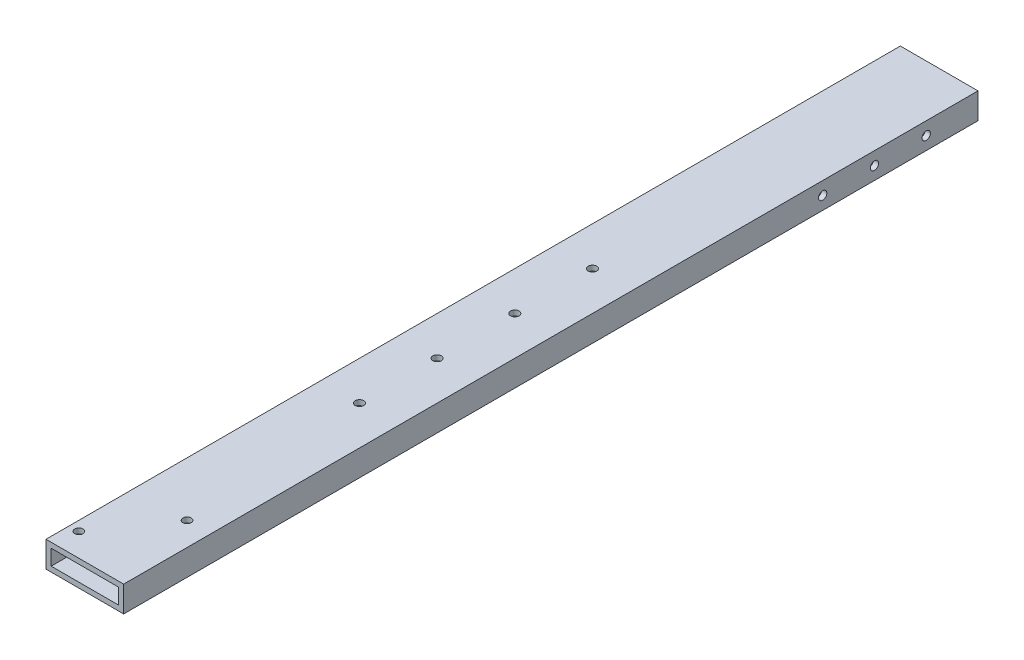
ISO-10303-21;
HEADER;
FILE_DESCRIPTION(('STEP AP214'),'2;1');
FILE_NAME('part.step','',(''),(''),'','','');
FILE_SCHEMA(('AUTOMOTIVE_DESIGN { 1 0 10303 214 1 1 1 1 }'));
ENDSEC;
DATA;
#1=APPLICATION_CONTEXT('core data for automotive mechanical design processes');
#2=APPLICATION_PROTOCOL_DEFINITION('international standard','automotive_design',2000,#1);
#3=PRODUCT_CONTEXT('',#1,'mechanical');
#4=PRODUCT('Part','Part','',(#3));
#5=PRODUCT_RELATED_PRODUCT_CATEGORY('part','',(#4));
#6=PRODUCT_DEFINITION_FORMATION('','',#4);
#7=PRODUCT_DEFINITION_CONTEXT('part definition',#1,'design');
#8=PRODUCT_DEFINITION('design','',#6,#7);
#9=PRODUCT_DEFINITION_SHAPE('','',#8);
#10=(LENGTH_UNIT() NAMED_UNIT(*) SI_UNIT(.MILLI.,.METRE.));
#11=(NAMED_UNIT(*) PLANE_ANGLE_UNIT() SI_UNIT($,.RADIAN.));
#12=(NAMED_UNIT(*) SI_UNIT($,.STERADIAN.) SOLID_ANGLE_UNIT());
#13=UNCERTAINTY_MEASURE_WITH_UNIT(LENGTH_MEASURE(1.E-05),#10,'distance_accuracy_value','');
#14=(GEOMETRIC_REPRESENTATION_CONTEXT(3) GLOBAL_UNCERTAINTY_ASSIGNED_CONTEXT((#13)) GLOBAL_UNIT_ASSIGNED_CONTEXT((#10,
#11,#12)) REPRESENTATION_CONTEXT('',''));
#15=CARTESIAN_POINT('',(0.,0.,0.));
#16=DIRECTION('',(0.,0.,1.));
#17=DIRECTION('',(1.,0.,0.));
#18=AXIS2_PLACEMENT_3D('',#15,#16,#17);
#19=CARTESIAN_POINT('',(0.,0.,330.));
#20=DIRECTION('',(0.,0.,1.));
#21=DIRECTION('',(1.,0.,0.));
#22=AXIS2_PLACEMENT_3D('',#19,#20,#21);
#23=PLANE('',#22);
#24=DIRECTION('',(0.,1.,0.));
#25=VECTOR('',#24,1.);
#26=CARTESIAN_POINT('',(15.,5.,330.));
#27=LINE('',#26,#25);
#28=CARTESIAN_POINT('',(15.,-5.,330.));
#29=VERTEX_POINT('',#28);
#30=CARTESIAN_POINT('',(15.,5.,330.));
#31=VERTEX_POINT('',#30);
#32=EDGE_CURVE('E161',#29,#31,#27,.T.);
#33=ORIENTED_EDGE('',*,*,#32,.T.);
#34=DIRECTION('',(-1.,0.,0.));
#35=VECTOR('',#34,1.);
#36=CARTESIAN_POINT('',(-15.,5.,330.));
#37=LINE('',#36,#35);
#38=CARTESIAN_POINT('',(-15.,5.,330.));
#39=VERTEX_POINT('',#38);
#40=EDGE_CURVE('E165',#31,#39,#37,.T.);
#41=ORIENTED_EDGE('',*,*,#40,.T.);
#42=DIRECTION('',(0.,-1.,0.));
#43=VECTOR('',#42,1.);
#44=CARTESIAN_POINT('',(-15.,5.,330.));
#45=LINE('',#44,#43);
#46=CARTESIAN_POINT('',(-15.,-5.,330.));
#47=VERTEX_POINT('',#46);
#48=EDGE_CURVE('E169',#39,#47,#45,.T.);
#49=ORIENTED_EDGE('',*,*,#48,.T.);
#50=DIRECTION('',(1.,0.,0.));
#51=VECTOR('',#50,1.);
#52=CARTESIAN_POINT('',(-15.,-5.,330.));
#53=LINE('',#52,#51);
#54=EDGE_CURVE('E172',#47,#29,#53,.T.);
#55=ORIENTED_EDGE('',*,*,#54,.T.);
#56=EDGE_LOOP('',(#33,#41,#49,#55));
#57=FACE_BOUND('',#56,.T.);
#58=DIRECTION('',(-1.,0.,0.));
#59=VECTOR('',#58,1.);
#60=CARTESIAN_POINT('',(-13.,3.,330.));
#61=LINE('',#60,#59);
#62=CARTESIAN_POINT('',(13.,3.,330.));
#63=VERTEX_POINT('',#62);
#64=CARTESIAN_POINT('',(-13.,3.,330.));
#65=VERTEX_POINT('',#64);
#66=EDGE_CURVE('E120',#63,#65,#61,.T.);
#67=ORIENTED_EDGE('',*,*,#66,.F.);
#68=DIRECTION('',(0.,1.,0.));
#69=VECTOR('',#68,1.);
#70=CARTESIAN_POINT('',(13.,3.,330.));
#71=LINE('',#70,#69);
#72=CARTESIAN_POINT('',(13.,-3.,330.));
#73=VERTEX_POINT('',#72);
#74=EDGE_CURVE('E111',#73,#63,#71,.T.);
#75=ORIENTED_EDGE('',*,*,#74,.F.);
#76=DIRECTION('',(1.,0.,0.));
#77=VECTOR('',#76,1.);
#78=CARTESIAN_POINT('',(-13.,-3.,330.));
#79=LINE('',#78,#77);
#80=CARTESIAN_POINT('',(-13.,-3.,330.));
#81=VERTEX_POINT('',#80);
#82=EDGE_CURVE('E137',#81,#73,#79,.T.);
#83=ORIENTED_EDGE('',*,*,#82,.F.);
#84=DIRECTION('',(0.,-1.,0.));
#85=VECTOR('',#84,1.);
#86=CARTESIAN_POINT('',(-13.,3.,330.));
#87=LINE('',#86,#85);
#88=EDGE_CURVE('E133',#65,#81,#87,.T.);
#89=ORIENTED_EDGE('',*,*,#88,.F.);
#90=EDGE_LOOP('',(#67,#75,#83,#89));
#91=FACE_BOUND('',#90,.T.);
#92=ADVANCED_FACE('F43',(#57,#91),#23,.T.);
#93=CARTESIAN_POINT('',(0.,0.,0.));
#94=DIRECTION('',(0.,0.,1.));
#95=DIRECTION('',(1.,0.,0.));
#96=AXIS2_PLACEMENT_3D('',#93,#94,#95);
#97=PLANE('',#96);
#98=DIRECTION('',(0.,1.,0.));
#99=VECTOR('',#98,1.);
#100=CARTESIAN_POINT('',(15.,5.,0.));
#101=LINE('',#100,#99);
#102=CARTESIAN_POINT('',(15.,-5.,0.));
#103=VERTEX_POINT('',#102);
#104=CARTESIAN_POINT('',(15.,5.,0.));
#105=VERTEX_POINT('',#104);
#106=EDGE_CURVE('E129',#103,#105,#101,.T.);
#107=ORIENTED_EDGE('',*,*,#106,.F.);
#108=DIRECTION('',(1.,0.,0.));
#109=VECTOR('',#108,1.);
#110=CARTESIAN_POINT('',(-15.,-5.,0.));
#111=LINE('',#110,#109);
#112=CARTESIAN_POINT('',(-15.,-5.,0.));
#113=VERTEX_POINT('',#112);
#114=EDGE_CURVE('E166',#113,#103,#111,.T.);
#115=ORIENTED_EDGE('',*,*,#114,.F.);
#116=DIRECTION('',(0.,-1.,0.));
#117=VECTOR('',#116,1.);
#118=CARTESIAN_POINT('',(-15.,5.,0.));
#119=LINE('',#118,#117);
#120=CARTESIAN_POINT('',(-15.,5.,0.));
#121=VERTEX_POINT('',#120);
#122=EDGE_CURVE('E182',#121,#113,#119,.T.);
#123=ORIENTED_EDGE('',*,*,#122,.F.);
#124=DIRECTION('',(-1.,0.,0.));
#125=VECTOR('',#124,1.);
#126=CARTESIAN_POINT('',(-15.,5.,0.));
#127=LINE('',#126,#125);
#128=EDGE_CURVE('E179',#105,#121,#127,.T.);
#129=ORIENTED_EDGE('',*,*,#128,.F.);
#130=EDGE_LOOP('',(#107,#115,#123,#129));
#131=FACE_BOUND('',#130,.T.);
#132=DIRECTION('',(0.,1.,0.));
#133=VECTOR('',#132,1.);
#134=CARTESIAN_POINT('',(13.,3.,0.));
#135=LINE('',#134,#133);
#136=CARTESIAN_POINT('',(13.,-3.,0.));
#137=VERTEX_POINT('',#136);
#138=CARTESIAN_POINT('',(13.,3.,0.));
#139=VERTEX_POINT('',#138);
#140=EDGE_CURVE('E69',#137,#139,#135,.T.);
#141=ORIENTED_EDGE('',*,*,#140,.T.);
#142=DIRECTION('',(-1.,0.,0.));
#143=VECTOR('',#142,1.);
#144=CARTESIAN_POINT('',(-13.,3.,0.));
#145=LINE('',#144,#143);
#146=CARTESIAN_POINT('',(-13.,3.,0.));
#147=VERTEX_POINT('',#146);
#148=EDGE_CURVE('E127',#139,#147,#145,.T.);
#149=ORIENTED_EDGE('',*,*,#148,.T.);
#150=DIRECTION('',(0.,-1.,0.));
#151=VECTOR('',#150,1.);
#152=CARTESIAN_POINT('',(-13.,3.,0.));
#153=LINE('',#152,#151);
#154=CARTESIAN_POINT('',(-13.,-3.,0.));
#155=VERTEX_POINT('',#154);
#156=EDGE_CURVE('E148',#147,#155,#153,.T.);
#157=ORIENTED_EDGE('',*,*,#156,.T.);
#158=DIRECTION('',(1.,0.,0.));
#159=VECTOR('',#158,1.);
#160=CARTESIAN_POINT('',(-13.,-3.,0.));
#161=LINE('',#160,#159);
#162=EDGE_CURVE('E121',#155,#137,#161,.T.);
#163=ORIENTED_EDGE('',*,*,#162,.T.);
#164=EDGE_LOOP('',(#141,#149,#157,#163));
#165=FACE_BOUND('',#164,.T.);
#166=ADVANCED_FACE('F339',(#131,#165),#97,.F.);
#167=CARTESIAN_POINT('',(15.,5.,330.));
#168=DIRECTION('',(-1.,0.,0.));
#169=DIRECTION('',(0.,0.,1.));
#170=AXIS2_PLACEMENT_3D('',#167,#168,#169);
#171=PLANE('',#170);
#172=CARTESIAN_POINT('',(15.,0.,20.));
#173=DIRECTION('',(-1.,0.,0.));
#174=DIRECTION('',(0.,0.,1.));
#175=AXIS2_PLACEMENT_3D('',#172,#173,#174);
#176=CIRCLE('',#175,1.6);
#177=CARTESIAN_POINT('',(15.,0.,21.6));
#178=VERTEX_POINT('',#177);
#179=EDGE_CURVE('E232',#178,#178,#176,.T.);
#180=ORIENTED_EDGE('',*,*,#179,.T.);
#181=EDGE_LOOP('',(#180));
#182=FACE_BOUND('',#181,.T.);
#183=CARTESIAN_POINT('',(15.,0.,40.));
#184=DIRECTION('',(-1.,0.,0.));
#185=DIRECTION('',(0.,0.,1.));
#186=AXIS2_PLACEMENT_3D('',#183,#184,#185);
#187=CIRCLE('',#186,1.60000000000001);
#188=CARTESIAN_POINT('',(15.,0.,41.6));
#189=VERTEX_POINT('',#188);
#190=EDGE_CURVE('E464',#189,#189,#187,.T.);
#191=ORIENTED_EDGE('',*,*,#190,.T.);
#192=EDGE_LOOP('',(#191));
#193=FACE_BOUND('',#192,.T.);
#194=CARTESIAN_POINT('',(15.,0.,60.));
#195=DIRECTION('',(-1.,0.,0.));
#196=DIRECTION('',(0.,0.,1.));
#197=AXIS2_PLACEMENT_3D('',#194,#195,#196);
#198=CIRCLE('',#197,1.60000000000001);
#199=CARTESIAN_POINT('',(15.,0.,61.6));
#200=VERTEX_POINT('',#199);
#201=EDGE_CURVE('E248',#200,#200,#198,.T.);
#202=ORIENTED_EDGE('',*,*,#201,.T.);
#203=EDGE_LOOP('',(#202));
#204=FACE_BOUND('',#203,.T.);
#205=ORIENTED_EDGE('',*,*,#106,.T.);
#206=DIRECTION('',(0.,0.,-1.));
#207=VECTOR('',#206,1.);
#208=CARTESIAN_POINT('',(15.,5.,330.));
#209=LINE('',#208,#207);
#210=EDGE_CURVE('E11',#31,#105,#209,.T.);
#211=ORIENTED_EDGE('',*,*,#210,.F.);
#212=ORIENTED_EDGE('',*,*,#32,.F.);
#213=DIRECTION('',(0.,0.,-1.));
#214=VECTOR('',#213,1.);
#215=CARTESIAN_POINT('',(15.,-5.,330.));
#216=LINE('',#215,#214);
#217=EDGE_CURVE('E175',#29,#103,#216,.T.);
#218=ORIENTED_EDGE('',*,*,#217,.T.);
#219=EDGE_LOOP('',(#205,#211,#212,#218));
#220=FACE_BOUND('',#219,.T.);
#221=ADVANCED_FACE('F45',(#182,#193,#204,#220),#171,.F.);
#222=CARTESIAN_POINT('',(-15.,5.,330.));
#223=DIRECTION('',(0.,-1.,0.));
#224=DIRECTION('',(0.,0.,-1.));
#225=AXIS2_PLACEMENT_3D('',#222,#223,#224);
#226=PLANE('',#225);
#227=CARTESIAN_POINT('',(5.90729309052507,5.,296.425438671338));
#228=DIRECTION('',(0.,1.,0.));
#229=DIRECTION('',(0.,0.,1.));
#230=AXIS2_PLACEMENT_3D('',#227,#228,#229);
#231=CIRCLE('',#230,1.60000000000869);
#232=CARTESIAN_POINT('',(5.90729309052507,5.,298.025438671347));
#233=VERTEX_POINT('',#232);
#234=EDGE_CURVE('E259',#233,#233,#231,.T.);
#235=ORIENTED_EDGE('',*,*,#234,.F.);
#236=EDGE_LOOP('',(#235));
#237=FACE_BOUND('',#236,.T.);
#238=CARTESIAN_POINT('',(-6.43929354282591E-12,5.,163.912345181778));
#239=DIRECTION('',(0.,1.,0.));
#240=DIRECTION('',(0.,0.,1.));
#241=AXIS2_PLACEMENT_3D('',#238,#239,#240);
#242=CIRCLE('',#241,1.65000000000617);
#243=CARTESIAN_POINT('',(-6.43929354282591E-12,5.,165.562345181784));
#244=VERTEX_POINT('',#243);
#245=EDGE_CURVE('E263',#244,#244,#242,.T.);
#246=ORIENTED_EDGE('',*,*,#245,.F.);
#247=EDGE_LOOP('',(#246));
#248=FACE_BOUND('',#247,.T.);
#249=CARTESIAN_POINT('',(-6.66133814775094E-12,5.,133.912345181778));
#250=DIRECTION('',(0.,1.,0.));
#251=DIRECTION('',(0.,0.,1.));
#252=AXIS2_PLACEMENT_3D('',#249,#250,#251);
#253=CIRCLE('',#252,1.65000000000584);
#254=CARTESIAN_POINT('',(-6.66133814775094E-12,5.,135.562345181784));
#255=VERTEX_POINT('',#254);
#256=EDGE_CURVE('E271',#255,#255,#253,.T.);
#257=ORIENTED_EDGE('',*,*,#256,.F.);
#258=EDGE_LOOP('',(#257));
#259=FACE_BOUND('',#258,.T.);
#260=CARTESIAN_POINT('',(-6.43929354282591E-12,5.,223.912345181778));
#261=DIRECTION('',(0.,1.,0.));
#262=DIRECTION('',(0.,0.,1.));
#263=AXIS2_PLACEMENT_3D('',#260,#261,#262);
#264=CIRCLE('',#263,1.6500000000061);
#265=CARTESIAN_POINT('',(-6.43929354282591E-12,5.,225.562345181784));
#266=VERTEX_POINT('',#265);
#267=EDGE_CURVE('E279',#266,#266,#264,.T.);
#268=ORIENTED_EDGE('',*,*,#267,.F.);
#269=EDGE_LOOP('',(#268));
#270=FACE_BOUND('',#269,.T.);
#271=CARTESIAN_POINT('',(-6.66133814775094E-12,5.,193.912345181778));
#272=DIRECTION('',(0.,1.,0.));
#273=DIRECTION('',(0.,0.,1.));
#274=AXIS2_PLACEMENT_3D('',#271,#272,#273);
#275=CIRCLE('',#274,1.65000000000881);
#276=CARTESIAN_POINT('',(-6.66133814775094E-12,5.,195.562345181787));
#277=VERTEX_POINT('',#276);
#278=EDGE_CURVE('E287',#277,#277,#275,.T.);
#279=ORIENTED_EDGE('',*,*,#278,.F.);
#280=EDGE_LOOP('',(#279));
#281=FACE_BOUND('',#280,.T.);
#282=CARTESIAN_POINT('',(-11.3,5.,321.));
#283=DIRECTION('',(0.,1.,0.));
#284=DIRECTION('',(0.,0.,1.));
#285=AXIS2_PLACEMENT_3D('',#282,#283,#284);
#286=CIRCLE('',#285,1.59999999999998);
#287=CARTESIAN_POINT('',(-11.3,5.,322.6));
#288=VERTEX_POINT('',#287);
#289=EDGE_CURVE('E309',#288,#288,#286,.T.);
#290=ORIENTED_EDGE('',*,*,#289,.F.);
#291=EDGE_LOOP('',(#290));
#292=FACE_BOUND('',#291,.T.);
#293=ORIENTED_EDGE('',*,*,#128,.T.);
#294=DIRECTION('',(0.,0.,-1.));
#295=VECTOR('',#294,1.);
#296=CARTESIAN_POINT('',(-15.,5.,330.));
#297=LINE('',#296,#295);
#298=EDGE_CURVE('E53',#39,#121,#297,.T.);
#299=ORIENTED_EDGE('',*,*,#298,.F.);
#300=ORIENTED_EDGE('',*,*,#40,.F.);
#301=ORIENTED_EDGE('',*,*,#210,.T.);
#302=EDGE_LOOP('',(#293,#299,#300,#301));
#303=FACE_BOUND('',#302,.T.);
#304=ADVANCED_FACE('F353',(#237,#248,#259,#270,#281,#292,#303),#226,.F.);
#305=CARTESIAN_POINT('',(-15.,5.,330.));
#306=DIRECTION('',(1.,0.,0.));
#307=DIRECTION('',(0.,1.,0.));
#308=AXIS2_PLACEMENT_3D('',#305,#306,#307);
#309=PLANE('',#308);
#310=CARTESIAN_POINT('',(-15.,0.,20.));
#311=DIRECTION('',(-1.,0.,0.));
#312=DIRECTION('',(0.,0.,1.));
#313=AXIS2_PLACEMENT_3D('',#310,#311,#312);
#314=CIRCLE('',#313,1.6);
#315=CARTESIAN_POINT('',(-15.,0.,21.6));
#316=VERTEX_POINT('',#315);
#317=EDGE_CURVE('E454',#316,#316,#314,.T.);
#318=ORIENTED_EDGE('',*,*,#317,.F.);
#319=EDGE_LOOP('',(#318));
#320=FACE_BOUND('',#319,.T.);
#321=CARTESIAN_POINT('',(-15.,0.,40.));
#322=DIRECTION('',(-1.,0.,0.));
#323=DIRECTION('',(0.,0.,1.));
#324=AXIS2_PLACEMENT_3D('',#321,#322,#323);
#325=CIRCLE('',#324,1.60000000000001);
#326=CARTESIAN_POINT('',(-15.,0.,41.6));
#327=VERTEX_POINT('',#326);
#328=EDGE_CURVE('E458',#327,#327,#325,.T.);
#329=ORIENTED_EDGE('',*,*,#328,.F.);
#330=EDGE_LOOP('',(#329));
#331=FACE_BOUND('',#330,.T.);
#332=CARTESIAN_POINT('',(-15.,0.,60.));
#333=DIRECTION('',(-1.,0.,0.));
#334=DIRECTION('',(0.,0.,1.));
#335=AXIS2_PLACEMENT_3D('',#332,#333,#334);
#336=CIRCLE('',#335,1.60000000000001);
#337=CARTESIAN_POINT('',(-15.,0.,61.6));
#338=VERTEX_POINT('',#337);
#339=EDGE_CURVE('E467',#338,#338,#336,.T.);
#340=ORIENTED_EDGE('',*,*,#339,.F.);
#341=EDGE_LOOP('',(#340));
#342=FACE_BOUND('',#341,.T.);
#343=ORIENTED_EDGE('',*,*,#122,.T.);
#344=DIRECTION('',(0.,0.,-1.));
#345=VECTOR('',#344,1.);
#346=CARTESIAN_POINT('',(-15.,-5.,330.));
#347=LINE('',#346,#345);
#348=EDGE_CURVE('E190',#47,#113,#347,.T.);
#349=ORIENTED_EDGE('',*,*,#348,.F.);
#350=ORIENTED_EDGE('',*,*,#48,.F.);
#351=ORIENTED_EDGE('',*,*,#298,.T.);
#352=EDGE_LOOP('',(#343,#349,#350,#351));
#353=FACE_BOUND('',#352,.T.);
#354=ADVANCED_FACE('F350',(#320,#331,#342,#353),#309,.F.);
#355=CARTESIAN_POINT('',(-15.,-5.,330.));
#356=DIRECTION('',(0.,1.,0.));
#357=DIRECTION('',(0.,0.,1.));
#358=AXIS2_PLACEMENT_3D('',#355,#356,#357);
#359=PLANE('',#358);
#360=CARTESIAN_POINT('',(5.90729309052507,-5.,296.425438671338));
#361=DIRECTION('',(0.,1.,0.));
#362=DIRECTION('',(0.,0.,1.));
#363=AXIS2_PLACEMENT_3D('',#360,#361,#362);
#364=CIRCLE('',#363,1.60000000000869);
#365=CARTESIAN_POINT('',(5.90729309052507,-5.,298.025438671347));
#366=VERTEX_POINT('',#365);
#367=EDGE_CURVE('E207',#366,#366,#364,.T.);
#368=ORIENTED_EDGE('',*,*,#367,.T.);
#369=EDGE_LOOP('',(#368));
#370=FACE_BOUND('',#369,.T.);
#371=CARTESIAN_POINT('',(-6.43929354282591E-12,-5.,163.912345181778));
#372=DIRECTION('',(0.,1.,0.));
#373=DIRECTION('',(0.,0.,1.));
#374=AXIS2_PLACEMENT_3D('',#371,#372,#373);
#375=CIRCLE('',#374,1.65000000000617);
#376=CARTESIAN_POINT('',(-6.43929354282591E-12,-5.,165.562345181784));
#377=VERTEX_POINT('',#376);
#378=EDGE_CURVE('E267',#377,#377,#375,.T.);
#379=ORIENTED_EDGE('',*,*,#378,.T.);
#380=EDGE_LOOP('',(#379));
#381=FACE_BOUND('',#380,.T.);
#382=CARTESIAN_POINT('',(-6.66133814775094E-12,-5.,133.912345181778));
#383=DIRECTION('',(0.,1.,0.));
#384=DIRECTION('',(0.,0.,1.));
#385=AXIS2_PLACEMENT_3D('',#382,#383,#384);
#386=CIRCLE('',#385,1.65000000000584);
#387=CARTESIAN_POINT('',(-6.66133814775094E-12,-5.,135.562345181784));
#388=VERTEX_POINT('',#387);
#389=EDGE_CURVE('E275',#388,#388,#386,.T.);
#390=ORIENTED_EDGE('',*,*,#389,.T.);
#391=EDGE_LOOP('',(#390));
#392=FACE_BOUND('',#391,.T.);
#393=CARTESIAN_POINT('',(-6.43929354282591E-12,-5.,223.912345181778));
#394=DIRECTION('',(0.,1.,0.));
#395=DIRECTION('',(0.,0.,1.));
#396=AXIS2_PLACEMENT_3D('',#393,#394,#395);
#397=CIRCLE('',#396,1.6500000000061);
#398=CARTESIAN_POINT('',(-6.43929354282591E-12,-5.,225.562345181784));
#399=VERTEX_POINT('',#398);
#400=EDGE_CURVE('E283',#399,#399,#397,.T.);
#401=ORIENTED_EDGE('',*,*,#400,.T.);
#402=EDGE_LOOP('',(#401));
#403=FACE_BOUND('',#402,.T.);
#404=CARTESIAN_POINT('',(-6.66133814775094E-12,-5.,193.912345181778));
#405=DIRECTION('',(0.,1.,0.));
#406=DIRECTION('',(0.,0.,1.));
#407=AXIS2_PLACEMENT_3D('',#404,#405,#406);
#408=CIRCLE('',#407,1.65000000000881);
#409=CARTESIAN_POINT('',(-6.66133814775094E-12,-5.,195.562345181787));
#410=VERTEX_POINT('',#409);
#411=EDGE_CURVE('E255',#410,#410,#408,.T.);
#412=ORIENTED_EDGE('',*,*,#411,.T.);
#413=EDGE_LOOP('',(#412));
#414=FACE_BOUND('',#413,.T.);
#415=CARTESIAN_POINT('',(-11.3,-5.,321.));
#416=DIRECTION('',(0.,1.,0.));
#417=DIRECTION('',(0.,0.,1.));
#418=AXIS2_PLACEMENT_3D('',#415,#416,#417);
#419=CIRCLE('',#418,1.59999999999998);
#420=CARTESIAN_POINT('',(-11.3,-5.,322.6));
#421=VERTEX_POINT('',#420);
#422=EDGE_CURVE('E201',#421,#421,#419,.T.);
#423=ORIENTED_EDGE('',*,*,#422,.T.);
#424=EDGE_LOOP('',(#423));
#425=FACE_BOUND('',#424,.T.);
#426=ORIENTED_EDGE('',*,*,#114,.T.);
#427=ORIENTED_EDGE('',*,*,#217,.F.);
#428=ORIENTED_EDGE('',*,*,#54,.F.);
#429=ORIENTED_EDGE('',*,*,#348,.T.);
#430=EDGE_LOOP('',(#426,#427,#428,#429));
#431=FACE_BOUND('',#430,.T.);
#432=ADVANCED_FACE('F333',(#370,#381,#392,#403,#414,#425,#431),#359,.F.);
#433=CARTESIAN_POINT('',(13.,3.,330.));
#434=DIRECTION('',(-1.,0.,0.));
#435=DIRECTION('',(0.,0.,1.));
#436=AXIS2_PLACEMENT_3D('',#433,#434,#435);
#437=PLANE('',#436);
#438=CARTESIAN_POINT('',(13.,0.,20.));
#439=DIRECTION('',(-1.,0.,0.));
#440=DIRECTION('',(0.,0.,1.));
#441=AXIS2_PLACEMENT_3D('',#438,#439,#440);
#442=CIRCLE('',#441,1.6);
#443=CARTESIAN_POINT('',(13.,0.,21.6));
#444=VERTEX_POINT('',#443);
#445=EDGE_CURVE('E251',#444,#444,#442,.T.);
#446=ORIENTED_EDGE('',*,*,#445,.F.);
#447=EDGE_LOOP('',(#446));
#448=FACE_BOUND('',#447,.T.);
#449=CARTESIAN_POINT('',(13.,0.,40.));
#450=DIRECTION('',(-1.,0.,0.));
#451=DIRECTION('',(0.,0.,1.));
#452=AXIS2_PLACEMENT_3D('',#449,#450,#451);
#453=CIRCLE('',#452,1.60000000000001);
#454=CARTESIAN_POINT('',(13.,0.,41.6));
#455=VERTEX_POINT('',#454);
#456=EDGE_CURVE('E236',#455,#455,#453,.T.);
#457=ORIENTED_EDGE('',*,*,#456,.F.);
#458=EDGE_LOOP('',(#457));
#459=FACE_BOUND('',#458,.T.);
#460=CARTESIAN_POINT('',(13.,0.,60.));
#461=DIRECTION('',(-1.,0.,0.));
#462=DIRECTION('',(0.,0.,1.));
#463=AXIS2_PLACEMENT_3D('',#460,#461,#462);
#464=CIRCLE('',#463,1.60000000000001);
#465=CARTESIAN_POINT('',(13.,0.,61.6));
#466=VERTEX_POINT('',#465);
#467=EDGE_CURVE('E231',#466,#466,#464,.T.);
#468=ORIENTED_EDGE('',*,*,#467,.F.);
#469=EDGE_LOOP('',(#468));
#470=FACE_BOUND('',#469,.T.);
#471=ORIENTED_EDGE('',*,*,#140,.F.);
#472=DIRECTION('',(0.,0.,-1.));
#473=VECTOR('',#472,1.);
#474=CARTESIAN_POINT('',(13.,-3.,330.));
#475=LINE('',#474,#473);
#476=EDGE_CURVE('E115',#73,#137,#475,.T.);
#477=ORIENTED_EDGE('',*,*,#476,.F.);
#478=ORIENTED_EDGE('',*,*,#74,.T.);
#479=DIRECTION('',(0.,0.,-1.));
#480=VECTOR('',#479,1.);
#481=CARTESIAN_POINT('',(13.,3.,330.));
#482=LINE('',#481,#480);
#483=EDGE_CURVE('E114',#63,#139,#482,.T.);
#484=ORIENTED_EDGE('',*,*,#483,.T.);
#485=EDGE_LOOP('',(#471,#477,#478,#484));
#486=FACE_BOUND('',#485,.T.);
#487=ADVANCED_FACE('F113',(#448,#459,#470,#486),#437,.T.);
#488=CARTESIAN_POINT('',(-13.,3.,330.));
#489=DIRECTION('',(0.,-1.,0.));
#490=DIRECTION('',(0.,0.,-1.));
#491=AXIS2_PLACEMENT_3D('',#488,#489,#490);
#492=PLANE('',#491);
#493=CARTESIAN_POINT('',(5.90729309052507,3.,296.425438671338));
#494=DIRECTION('',(0.,-1.,0.));
#495=DIRECTION('',(0.,0.,-1.));
#496=AXIS2_PLACEMENT_3D('',#493,#494,#495);
#497=CIRCLE('',#496,1.60000000000869);
#498=CARTESIAN_POINT('',(5.90729309052507,3.,294.82543867133));
#499=VERTEX_POINT('',#498);
#500=EDGE_CURVE('E227',#499,#499,#497,.T.);
#501=ORIENTED_EDGE('',*,*,#500,.F.);
#502=EDGE_LOOP('',(#501));
#503=FACE_BOUND('',#502,.T.);
#504=CARTESIAN_POINT('',(-6.43929354282591E-12,3.,163.912345181778));
#505=DIRECTION('',(0.,-1.,0.));
#506=DIRECTION('',(0.,0.,-1.));
#507=AXIS2_PLACEMENT_3D('',#504,#505,#506);
#508=CIRCLE('',#507,1.65000000000617);
#509=CARTESIAN_POINT('',(-6.43929354282591E-12,3.,162.262345181772));
#510=VERTEX_POINT('',#509);
#511=EDGE_CURVE('E222',#510,#510,#508,.T.);
#512=ORIENTED_EDGE('',*,*,#511,.F.);
#513=EDGE_LOOP('',(#512));
#514=FACE_BOUND('',#513,.T.);
#515=CARTESIAN_POINT('',(-6.66133814775094E-12,3.,133.912345181778));
#516=DIRECTION('',(0.,-1.,0.));
#517=DIRECTION('',(0.,0.,-1.));
#518=AXIS2_PLACEMENT_3D('',#515,#516,#517);
#519=CIRCLE('',#518,1.65000000000584);
#520=CARTESIAN_POINT('',(-6.66133814775094E-12,3.,132.262345181772));
#521=VERTEX_POINT('',#520);
#522=EDGE_CURVE('E217',#521,#521,#519,.T.);
#523=ORIENTED_EDGE('',*,*,#522,.F.);
#524=EDGE_LOOP('',(#523));
#525=FACE_BOUND('',#524,.T.);
#526=CARTESIAN_POINT('',(-6.43929354282591E-12,3.,223.912345181778));
#527=DIRECTION('',(0.,-1.,0.));
#528=DIRECTION('',(0.,0.,-1.));
#529=AXIS2_PLACEMENT_3D('',#526,#527,#528);
#530=CIRCLE('',#529,1.6500000000061);
#531=CARTESIAN_POINT('',(-6.43929354282591E-12,3.,222.262345181772));
#532=VERTEX_POINT('',#531);
#533=EDGE_CURVE('E212',#532,#532,#530,.T.);
#534=ORIENTED_EDGE('',*,*,#533,.F.);
#535=EDGE_LOOP('',(#534));
#536=FACE_BOUND('',#535,.T.);
#537=CARTESIAN_POINT('',(-6.66133814775094E-12,3.,193.912345181778));
#538=DIRECTION('',(0.,-1.,0.));
#539=DIRECTION('',(0.,0.,-1.));
#540=AXIS2_PLACEMENT_3D('',#537,#538,#539);
#541=CIRCLE('',#540,1.65000000000881);
#542=CARTESIAN_POINT('',(-6.66133814775094E-12,3.,192.262345181769));
#543=VERTEX_POINT('',#542);
#544=EDGE_CURVE('E206',#543,#543,#541,.T.);
#545=ORIENTED_EDGE('',*,*,#544,.F.);
#546=EDGE_LOOP('',(#545));
#547=FACE_BOUND('',#546,.T.);
#548=CARTESIAN_POINT('',(-11.3,3.,321.));
#549=DIRECTION('',(0.,-1.,0.));
#550=DIRECTION('',(0.,0.,-1.));
#551=AXIS2_PLACEMENT_3D('',#548,#549,#550);
#552=CIRCLE('',#551,1.59999999999998);
#553=CARTESIAN_POINT('',(-11.3,3.,319.4));
#554=VERTEX_POINT('',#553);
#555=EDGE_CURVE('E145',#554,#554,#552,.T.);
#556=ORIENTED_EDGE('',*,*,#555,.F.);
#557=EDGE_LOOP('',(#556));
#558=FACE_BOUND('',#557,.T.);
#559=ORIENTED_EDGE('',*,*,#148,.F.);
#560=ORIENTED_EDGE('',*,*,#483,.F.);
#561=ORIENTED_EDGE('',*,*,#66,.T.);
#562=DIRECTION('',(0.,0.,-1.));
#563=VECTOR('',#562,1.);
#564=CARTESIAN_POINT('',(-13.,3.,330.));
#565=LINE('',#564,#563);
#566=EDGE_CURVE('E130',#65,#147,#565,.T.);
#567=ORIENTED_EDGE('',*,*,#566,.T.);
#568=EDGE_LOOP('',(#559,#560,#561,#567));
#569=FACE_BOUND('',#568,.T.);
#570=ADVANCED_FACE('F124',(#503,#514,#525,#536,#547,#558,#569),#492,.T.);
#571=CARTESIAN_POINT('',(-13.,3.,330.));
#572=DIRECTION('',(1.,0.,0.));
#573=DIRECTION('',(0.,0.,-1.));
#574=AXIS2_PLACEMENT_3D('',#571,#572,#573);
#575=PLANE('',#574);
#576=CARTESIAN_POINT('',(-13.,0.,20.));
#577=DIRECTION('',(1.,0.,0.));
#578=DIRECTION('',(0.,0.,-1.));
#579=AXIS2_PLACEMENT_3D('',#576,#577,#578);
#580=CIRCLE('',#579,1.6);
#581=CARTESIAN_POINT('',(-13.,0.,18.4));
#582=VERTEX_POINT('',#581);
#583=EDGE_CURVE('E47',#582,#582,#580,.T.);
#584=ORIENTED_EDGE('',*,*,#583,.F.);
#585=EDGE_LOOP('',(#584));
#586=FACE_BOUND('',#585,.T.);
#587=CARTESIAN_POINT('',(-13.,0.,40.));
#588=DIRECTION('',(1.,0.,0.));
#589=DIRECTION('',(0.,0.,-1.));
#590=AXIS2_PLACEMENT_3D('',#587,#588,#589);
#591=CIRCLE('',#590,1.60000000000001);
#592=CARTESIAN_POINT('',(-13.,0.,38.4));
#593=VERTEX_POINT('',#592);
#594=EDGE_CURVE('E233',#593,#593,#591,.T.);
#595=ORIENTED_EDGE('',*,*,#594,.F.);
#596=EDGE_LOOP('',(#595));
#597=FACE_BOUND('',#596,.T.);
#598=CARTESIAN_POINT('',(-13.,0.,60.));
#599=DIRECTION('',(1.,0.,0.));
#600=DIRECTION('',(0.,0.,-1.));
#601=AXIS2_PLACEMENT_3D('',#598,#599,#600);
#602=CIRCLE('',#601,1.60000000000001);
#603=CARTESIAN_POINT('',(-13.,0.,58.4));
#604=VERTEX_POINT('',#603);
#605=EDGE_CURVE('E228',#604,#604,#602,.T.);
#606=ORIENTED_EDGE('',*,*,#605,.F.);
#607=EDGE_LOOP('',(#606));
#608=FACE_BOUND('',#607,.T.);
#609=ORIENTED_EDGE('',*,*,#156,.F.);
#610=ORIENTED_EDGE('',*,*,#566,.F.);
#611=ORIENTED_EDGE('',*,*,#88,.T.);
#612=DIRECTION('',(0.,0.,-1.));
#613=VECTOR('',#612,1.);
#614=CARTESIAN_POINT('',(-13.,-3.,330.));
#615=LINE('',#614,#613);
#616=EDGE_CURVE('E61',#81,#155,#615,.T.);
#617=ORIENTED_EDGE('',*,*,#616,.T.);
#618=EDGE_LOOP('',(#609,#610,#611,#617));
#619=FACE_BOUND('',#618,.T.);
#620=ADVANCED_FACE('F323',(#586,#597,#608,#619),#575,.T.);
#621=CARTESIAN_POINT('',(-13.,-3.,330.));
#622=DIRECTION('',(0.,1.,0.));
#623=DIRECTION('',(0.,0.,1.));
#624=AXIS2_PLACEMENT_3D('',#621,#622,#623);
#625=PLANE('',#624);
#626=CARTESIAN_POINT('',(5.90729309052507,-3.,296.425438671338));
#627=DIRECTION('',(0.,1.,0.));
#628=DIRECTION('',(0.,0.,1.));
#629=AXIS2_PLACEMENT_3D('',#626,#627,#628);
#630=CIRCLE('',#629,1.60000000000869);
#631=CARTESIAN_POINT('',(5.90729309052507,-3.,298.025438671347));
#632=VERTEX_POINT('',#631);
#633=EDGE_CURVE('E223',#632,#632,#630,.T.);
#634=ORIENTED_EDGE('',*,*,#633,.F.);
#635=EDGE_LOOP('',(#634));
#636=FACE_BOUND('',#635,.T.);
#637=CARTESIAN_POINT('',(-6.43929354282591E-12,-3.,163.912345181778));
#638=DIRECTION('',(0.,1.,0.));
#639=DIRECTION('',(0.,0.,1.));
#640=AXIS2_PLACEMENT_3D('',#637,#638,#639);
#641=CIRCLE('',#640,1.65000000000617);
#642=CARTESIAN_POINT('',(-6.43929354282591E-12,-3.,165.562345181784));
#643=VERTEX_POINT('',#642);
#644=EDGE_CURVE('E218',#643,#643,#641,.T.);
#645=ORIENTED_EDGE('',*,*,#644,.F.);
#646=EDGE_LOOP('',(#645));
#647=FACE_BOUND('',#646,.T.);
#648=CARTESIAN_POINT('',(-6.66133814775094E-12,-3.,133.912345181778));
#649=DIRECTION('',(0.,1.,0.));
#650=DIRECTION('',(0.,0.,1.));
#651=AXIS2_PLACEMENT_3D('',#648,#649,#650);
#652=CIRCLE('',#651,1.65000000000584);
#653=CARTESIAN_POINT('',(-6.66133814775094E-12,-3.,135.562345181784));
#654=VERTEX_POINT('',#653);
#655=EDGE_CURVE('E213',#654,#654,#652,.T.);
#656=ORIENTED_EDGE('',*,*,#655,.F.);
#657=EDGE_LOOP('',(#656));
#658=FACE_BOUND('',#657,.T.);
#659=CARTESIAN_POINT('',(-6.43929354282591E-12,-3.,223.912345181778));
#660=DIRECTION('',(0.,1.,0.));
#661=DIRECTION('',(0.,0.,1.));
#662=AXIS2_PLACEMENT_3D('',#659,#660,#661);
#663=CIRCLE('',#662,1.6500000000061);
#664=CARTESIAN_POINT('',(-6.43929354282591E-12,-3.,225.562345181784));
#665=VERTEX_POINT('',#664);
#666=EDGE_CURVE('E208',#665,#665,#663,.T.);
#667=ORIENTED_EDGE('',*,*,#666,.F.);
#668=EDGE_LOOP('',(#667));
#669=FACE_BOUND('',#668,.T.);
#670=CARTESIAN_POINT('',(-6.66133814775094E-12,-3.,193.912345181778));
#671=DIRECTION('',(0.,1.,0.));
#672=DIRECTION('',(0.,0.,1.));
#673=AXIS2_PLACEMENT_3D('',#670,#671,#672);
#674=CIRCLE('',#673,1.65000000000881);
#675=CARTESIAN_POINT('',(-6.66133814775094E-12,-3.,195.562345181787));
#676=VERTEX_POINT('',#675);
#677=EDGE_CURVE('E202',#676,#676,#674,.T.);
#678=ORIENTED_EDGE('',*,*,#677,.F.);
#679=EDGE_LOOP('',(#678));
#680=FACE_BOUND('',#679,.T.);
#681=CARTESIAN_POINT('',(-11.3,-3.,321.));
#682=DIRECTION('',(0.,1.,0.));
#683=DIRECTION('',(0.,0.,1.));
#684=AXIS2_PLACEMENT_3D('',#681,#682,#683);
#685=CIRCLE('',#684,1.59999999999998);
#686=CARTESIAN_POINT('',(-11.3,-3.,322.6));
#687=VERTEX_POINT('',#686);
#688=EDGE_CURVE('E197',#687,#687,#685,.T.);
#689=ORIENTED_EDGE('',*,*,#688,.F.);
#690=EDGE_LOOP('',(#689));
#691=FACE_BOUND('',#690,.T.);
#692=ORIENTED_EDGE('',*,*,#162,.F.);
#693=ORIENTED_EDGE('',*,*,#616,.F.);
#694=ORIENTED_EDGE('',*,*,#82,.T.);
#695=ORIENTED_EDGE('',*,*,#476,.T.);
#696=EDGE_LOOP('',(#692,#693,#694,#695));
#697=FACE_BOUND('',#696,.T.);
#698=ADVANCED_FACE('F330',(#636,#647,#658,#669,#680,#691,#697),#625,.T.);
#699=CARTESIAN_POINT('',(-11.3,-5.,321.));
#700=DIRECTION('',(0.,1.,0.));
#701=DIRECTION('',(0.,0.,1.));
#702=AXIS2_PLACEMENT_3D('',#699,#700,#701);
#703=CYLINDRICAL_SURFACE('',#702,1.59999999999998);
#704=ORIENTED_EDGE('',*,*,#688,.T.);
#705=EDGE_LOOP('',(#704));
#706=FACE_BOUND('',#705,.T.);
#707=ORIENTED_EDGE('',*,*,#422,.F.);
#708=EDGE_LOOP('',(#707));
#709=FACE_BOUND('',#708,.T.);
#710=ADVANCED_FACE('F389',(#706,#709),#703,.F.);
#711=ORIENTED_EDGE('',*,*,#555,.T.);
#712=EDGE_LOOP('',(#711));
#713=FACE_BOUND('',#712,.T.);
#714=ORIENTED_EDGE('',*,*,#289,.T.);
#715=EDGE_LOOP('',(#714));
#716=FACE_BOUND('',#715,.T.);
#717=ADVANCED_FACE('F319',(#713,#716),#703,.F.);
#718=CARTESIAN_POINT('',(-6.66133814775094E-12,-5.,193.912345181778));
#719=DIRECTION('',(0.,1.,0.));
#720=DIRECTION('',(0.,0.,1.));
#721=AXIS2_PLACEMENT_3D('',#718,#719,#720);
#722=CYLINDRICAL_SURFACE('',#721,1.65000000000881);
#723=ORIENTED_EDGE('',*,*,#677,.T.);
#724=EDGE_LOOP('',(#723));
#725=FACE_BOUND('',#724,.T.);
#726=ORIENTED_EDGE('',*,*,#411,.F.);
#727=EDGE_LOOP('',(#726));
#728=FACE_BOUND('',#727,.T.);
#729=ADVANCED_FACE('F400',(#725,#728),#722,.F.);
#730=CARTESIAN_POINT('',(-6.43929354282591E-12,-5.,223.912345181778));
#731=DIRECTION('',(0.,1.,0.));
#732=DIRECTION('',(0.,0.,1.));
#733=AXIS2_PLACEMENT_3D('',#730,#731,#732);
#734=CYLINDRICAL_SURFACE('',#733,1.6500000000061);
#735=ORIENTED_EDGE('',*,*,#666,.T.);
#736=EDGE_LOOP('',(#735));
#737=FACE_BOUND('',#736,.T.);
#738=ORIENTED_EDGE('',*,*,#400,.F.);
#739=EDGE_LOOP('',(#738));
#740=FACE_BOUND('',#739,.T.);
#741=ADVANCED_FACE('F403',(#737,#740),#734,.F.);
#742=CARTESIAN_POINT('',(-6.66133814775094E-12,-5.,133.912345181778));
#743=DIRECTION('',(0.,1.,0.));
#744=DIRECTION('',(0.,0.,1.));
#745=AXIS2_PLACEMENT_3D('',#742,#743,#744);
#746=CYLINDRICAL_SURFACE('',#745,1.65000000000584);
#747=ORIENTED_EDGE('',*,*,#655,.T.);
#748=EDGE_LOOP('',(#747));
#749=FACE_BOUND('',#748,.T.);
#750=ORIENTED_EDGE('',*,*,#389,.F.);
#751=EDGE_LOOP('',(#750));
#752=FACE_BOUND('',#751,.T.);
#753=ADVANCED_FACE('F408',(#749,#752),#746,.F.);
#754=CARTESIAN_POINT('',(-6.43929354282591E-12,-5.,163.912345181778));
#755=DIRECTION('',(0.,1.,0.));
#756=DIRECTION('',(0.,0.,1.));
#757=AXIS2_PLACEMENT_3D('',#754,#755,#756);
#758=CYLINDRICAL_SURFACE('',#757,1.65000000000617);
#759=ORIENTED_EDGE('',*,*,#644,.T.);
#760=EDGE_LOOP('',(#759));
#761=FACE_BOUND('',#760,.T.);
#762=ORIENTED_EDGE('',*,*,#378,.F.);
#763=EDGE_LOOP('',(#762));
#764=FACE_BOUND('',#763,.T.);
#765=ADVANCED_FACE('F413',(#761,#764),#758,.F.);
#766=CARTESIAN_POINT('',(5.90729309052507,-5.,296.425438671338));
#767=DIRECTION('',(0.,1.,0.));
#768=DIRECTION('',(0.,0.,1.));
#769=AXIS2_PLACEMENT_3D('',#766,#767,#768);
#770=CYLINDRICAL_SURFACE('',#769,1.60000000000869);
#771=ORIENTED_EDGE('',*,*,#633,.T.);
#772=EDGE_LOOP('',(#771));
#773=FACE_BOUND('',#772,.T.);
#774=ORIENTED_EDGE('',*,*,#367,.F.);
#775=EDGE_LOOP('',(#774));
#776=FACE_BOUND('',#775,.T.);
#777=ADVANCED_FACE('F418',(#773,#776),#770,.F.);
#778=ORIENTED_EDGE('',*,*,#544,.T.);
#779=EDGE_LOOP('',(#778));
#780=FACE_BOUND('',#779,.T.);
#781=ORIENTED_EDGE('',*,*,#278,.T.);
#782=EDGE_LOOP('',(#781));
#783=FACE_BOUND('',#782,.T.);
#784=ADVANCED_FACE('F405',(#780,#783),#722,.F.);
#785=ORIENTED_EDGE('',*,*,#533,.T.);
#786=EDGE_LOOP('',(#785));
#787=FACE_BOUND('',#786,.T.);
#788=ORIENTED_EDGE('',*,*,#267,.T.);
#789=EDGE_LOOP('',(#788));
#790=FACE_BOUND('',#789,.T.);
#791=ADVANCED_FACE('F410',(#787,#790),#734,.F.);
#792=ORIENTED_EDGE('',*,*,#522,.T.);
#793=EDGE_LOOP('',(#792));
#794=FACE_BOUND('',#793,.T.);
#795=ORIENTED_EDGE('',*,*,#256,.T.);
#796=EDGE_LOOP('',(#795));
#797=FACE_BOUND('',#796,.T.);
#798=ADVANCED_FACE('F415',(#794,#797),#746,.F.);
#799=ORIENTED_EDGE('',*,*,#511,.T.);
#800=EDGE_LOOP('',(#799));
#801=FACE_BOUND('',#800,.T.);
#802=ORIENTED_EDGE('',*,*,#245,.T.);
#803=EDGE_LOOP('',(#802));
#804=FACE_BOUND('',#803,.T.);
#805=ADVANCED_FACE('F420',(#801,#804),#758,.F.);
#806=ORIENTED_EDGE('',*,*,#500,.T.);
#807=EDGE_LOOP('',(#806));
#808=FACE_BOUND('',#807,.T.);
#809=ORIENTED_EDGE('',*,*,#234,.T.);
#810=EDGE_LOOP('',(#809));
#811=FACE_BOUND('',#810,.T.);
#812=ADVANCED_FACE('F424',(#808,#811),#770,.F.);
#813=CARTESIAN_POINT('',(15.,0.,60.));
#814=DIRECTION('',(-1.,0.,0.));
#815=DIRECTION('',(0.,0.,1.));
#816=AXIS2_PLACEMENT_3D('',#813,#814,#815);
#817=CYLINDRICAL_SURFACE('',#816,1.60000000000001);
#818=ORIENTED_EDGE('',*,*,#605,.T.);
#819=EDGE_LOOP('',(#818));
#820=FACE_BOUND('',#819,.T.);
#821=ORIENTED_EDGE('',*,*,#339,.T.);
#822=EDGE_LOOP('',(#821));
#823=FACE_BOUND('',#822,.T.);
#824=ADVANCED_FACE('F425',(#820,#823),#817,.F.);
#825=CARTESIAN_POINT('',(15.,0.,40.));
#826=DIRECTION('',(-1.,0.,0.));
#827=DIRECTION('',(0.,0.,1.));
#828=AXIS2_PLACEMENT_3D('',#825,#826,#827);
#829=CYLINDRICAL_SURFACE('',#828,1.60000000000001);
#830=ORIENTED_EDGE('',*,*,#594,.T.);
#831=EDGE_LOOP('',(#830));
#832=FACE_BOUND('',#831,.T.);
#833=ORIENTED_EDGE('',*,*,#328,.T.);
#834=EDGE_LOOP('',(#833));
#835=FACE_BOUND('',#834,.T.);
#836=ADVANCED_FACE('F428',(#832,#835),#829,.F.);
#837=CARTESIAN_POINT('',(15.,0.,20.));
#838=DIRECTION('',(-1.,0.,0.));
#839=DIRECTION('',(0.,0.,1.));
#840=AXIS2_PLACEMENT_3D('',#837,#838,#839);
#841=CYLINDRICAL_SURFACE('',#840,1.6);
#842=ORIENTED_EDGE('',*,*,#583,.T.);
#843=EDGE_LOOP('',(#842));
#844=FACE_BOUND('',#843,.T.);
#845=ORIENTED_EDGE('',*,*,#317,.T.);
#846=EDGE_LOOP('',(#845));
#847=FACE_BOUND('',#846,.T.);
#848=ADVANCED_FACE('F433',(#844,#847),#841,.F.);
#849=ORIENTED_EDGE('',*,*,#467,.T.);
#850=EDGE_LOOP('',(#849));
#851=FACE_BOUND('',#850,.T.);
#852=ORIENTED_EDGE('',*,*,#201,.F.);
#853=EDGE_LOOP('',(#852));
#854=FACE_BOUND('',#853,.T.);
#855=ADVANCED_FACE('F430',(#851,#854),#817,.F.);
#856=ORIENTED_EDGE('',*,*,#456,.T.);
#857=EDGE_LOOP('',(#856));
#858=FACE_BOUND('',#857,.T.);
#859=ORIENTED_EDGE('',*,*,#190,.F.);
#860=EDGE_LOOP('',(#859));
#861=FACE_BOUND('',#860,.T.);
#862=ADVANCED_FACE('F434',(#858,#861),#829,.F.);
#863=ORIENTED_EDGE('',*,*,#445,.T.);
#864=EDGE_LOOP('',(#863));
#865=FACE_BOUND('',#864,.T.);
#866=ORIENTED_EDGE('',*,*,#179,.F.);
#867=EDGE_LOOP('',(#866));
#868=FACE_BOUND('',#867,.T.);
#869=ADVANCED_FACE('F437',(#865,#868),#841,.F.);
#870=CLOSED_SHELL('',(#92,#166,#221,#304,#354,#432,#487,#570,#620,#698,#710,#717,#729,#741,#753,
#765,#777,#784,#791,#798,#805,#812,#824,#836,#848,#855,#862,#869));
#871=MANIFOLD_SOLID_BREP('B2',#870);
#872=ADVANCED_BREP_SHAPE_REPRESENTATION('',(#18,#871),#14);
#873=SHAPE_DEFINITION_REPRESENTATION(#9,#872);
ENDSEC;
END-ISO-10303-21;
